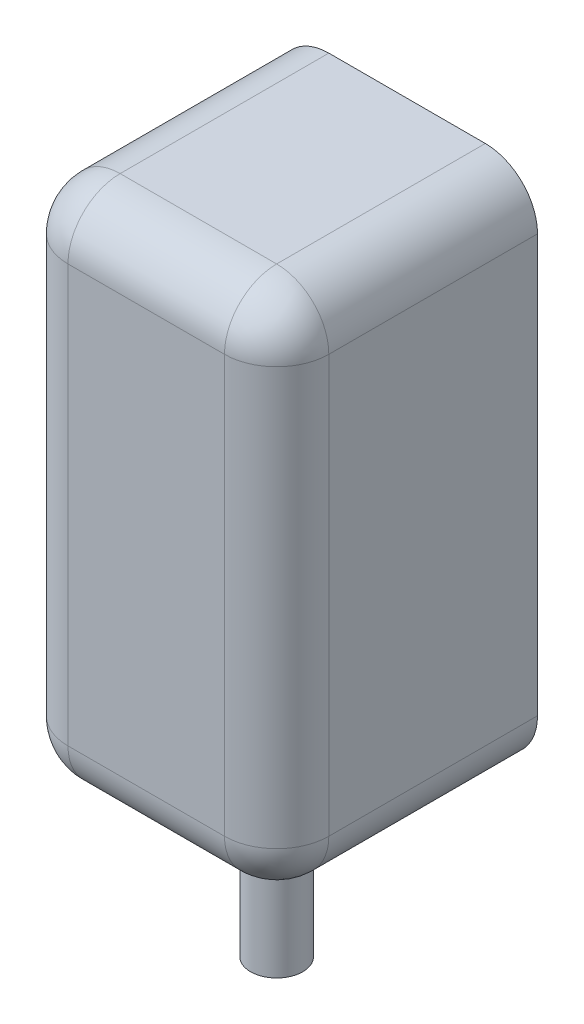
ISO-10303-21;
HEADER;
FILE_DESCRIPTION(('STEP AP214'),'2;1');
FILE_NAME('part.step','',(''),(''),'','','');
FILE_SCHEMA(('AUTOMOTIVE_DESIGN { 1 0 10303 214 1 1 1 1 }'));
ENDSEC;
DATA;
#1=APPLICATION_CONTEXT('core data for automotive mechanical design processes');
#2=APPLICATION_PROTOCOL_DEFINITION('international standard','automotive_design',2000,#1);
#3=PRODUCT_CONTEXT('',#1,'mechanical');
#4=PRODUCT('Part','Part','',(#3));
#5=PRODUCT_RELATED_PRODUCT_CATEGORY('part','',(#4));
#6=PRODUCT_DEFINITION_FORMATION('','',#4);
#7=PRODUCT_DEFINITION_CONTEXT('part definition',#1,'design');
#8=PRODUCT_DEFINITION('design','',#6,#7);
#9=PRODUCT_DEFINITION_SHAPE('','',#8);
#10=(LENGTH_UNIT() NAMED_UNIT(*) SI_UNIT(.MILLI.,.METRE.));
#11=(NAMED_UNIT(*) PLANE_ANGLE_UNIT() SI_UNIT($,.RADIAN.));
#12=(NAMED_UNIT(*) SI_UNIT($,.STERADIAN.) SOLID_ANGLE_UNIT());
#13=UNCERTAINTY_MEASURE_WITH_UNIT(LENGTH_MEASURE(1.E-05),#10,'distance_accuracy_value','');
#14=(GEOMETRIC_REPRESENTATION_CONTEXT(3) GLOBAL_UNCERTAINTY_ASSIGNED_CONTEXT((#13)) GLOBAL_UNIT_ASSIGNED_CONTEXT((#10,
#11,#12)) REPRESENTATION_CONTEXT('',''));
#15=CARTESIAN_POINT('',(0.,0.,0.));
#16=DIRECTION('',(0.,0.,1.));
#17=DIRECTION('',(1.,0.,0.));
#18=AXIS2_PLACEMENT_3D('',#15,#16,#17);
#19=CARTESIAN_POINT('',(0.,0.,0.));
#20=DIRECTION('',(0.,1.,0.));
#21=DIRECTION('',(0.,0.,1.));
#22=AXIS2_PLACEMENT_3D('',#19,#20,#21);
#23=PLANE('',#22);
#24=DIRECTION('',(1.,0.,0.));
#25=VECTOR('',#24,1.);
#26=CARTESIAN_POINT('',(0.,0.,15.));
#27=LINE('',#26,#25);
#28=CARTESIAN_POINT('',(15.,0.,15.));
#29=VERTEX_POINT('',#28);
#30=CARTESIAN_POINT('',(-15.,0.,15.));
#31=VERTEX_POINT('',#30);
#32=EDGE_CURVE('E233',#29,#31,#27,.F.);
#33=ORIENTED_EDGE('',*,*,#32,.T.);
#34=DIRECTION('',(0.,0.,1.));
#35=VECTOR('',#34,1.);
#36=CARTESIAN_POINT('',(-15.,0.,0.));
#37=LINE('',#36,#35);
#38=CARTESIAN_POINT('',(-15.,0.,-25.));
#39=VERTEX_POINT('',#38);
#40=EDGE_CURVE('E11',#31,#39,#37,.F.);
#41=ORIENTED_EDGE('',*,*,#40,.T.);
#42=DIRECTION('',(-1.,0.,0.));
#43=VECTOR('',#42,1.);
#44=CARTESIAN_POINT('',(-25.,0.,-25.));
#45=LINE('',#44,#43);
#46=CARTESIAN_POINT('',(15.,0.,-25.));
#47=VERTEX_POINT('',#46);
#48=EDGE_CURVE('E211',#47,#39,#45,.T.);
#49=ORIENTED_EDGE('',*,*,#48,.F.);
#50=DIRECTION('',(0.,0.,-1.));
#51=VECTOR('',#50,1.);
#52=CARTESIAN_POINT('',(15.,0.,0.));
#53=LINE('',#52,#51);
#54=EDGE_CURVE('E46',#47,#29,#53,.F.);
#55=ORIENTED_EDGE('',*,*,#54,.T.);
#56=EDGE_LOOP('',(#33,#41,#49,#55));
#57=FACE_BOUND('',#56,.T.);
#58=CARTESIAN_POINT('',(0.,0.,0.));
#59=DIRECTION('',(0.,1.,0.));
#60=DIRECTION('',(0.,0.,1.));
#61=AXIS2_PLACEMENT_3D('',#58,#59,#60);
#62=CIRCLE('',#61,5.);
#63=CARTESIAN_POINT('',(0.,0.,5.));
#64=VERTEX_POINT('',#63);
#65=EDGE_CURVE('E150',#64,#64,#62,.F.);
#66=ORIENTED_EDGE('',*,*,#65,.F.);
#67=EDGE_LOOP('',(#66));
#68=FACE_BOUND('',#67,.T.);
#69=ADVANCED_FACE('F37',(#57,#68),#23,.F.);
#70=CARTESIAN_POINT('',(25.,100.,-25.));
#71=DIRECTION('',(-1.,0.,0.));
#72=DIRECTION('',(0.,0.,1.));
#73=AXIS2_PLACEMENT_3D('',#70,#71,#72);
#74=PLANE('',#73);
#75=DIRECTION('',(0.,-1.,0.));
#76=VECTOR('',#75,1.);
#77=CARTESIAN_POINT('',(25.,100.,-25.));
#78=LINE('',#77,#76);
#79=CARTESIAN_POINT('',(25.,90.,-25.));
#80=VERTEX_POINT('',#79);
#81=CARTESIAN_POINT('',(25.,9.99999999999999,-25.));
#82=VERTEX_POINT('',#81);
#83=EDGE_CURVE('E213',#80,#82,#78,.T.);
#84=ORIENTED_EDGE('',*,*,#83,.F.);
#85=DIRECTION('',(0.,0.,-1.));
#86=VECTOR('',#85,1.);
#87=CARTESIAN_POINT('',(25.,90.,15.));
#88=LINE('',#87,#86);
#89=CARTESIAN_POINT('',(25.,90.,15.));
#90=VERTEX_POINT('',#89);
#91=EDGE_CURVE('E187',#80,#90,#88,.F.);
#92=ORIENTED_EDGE('',*,*,#91,.T.);
#93=DIRECTION('',(0.,-1.,0.));
#94=VECTOR('',#93,1.);
#95=CARTESIAN_POINT('',(25.,100.,15.));
#96=LINE('',#95,#94);
#97=CARTESIAN_POINT('',(25.,9.99999999999999,15.));
#98=VERTEX_POINT('',#97);
#99=EDGE_CURVE('E236',#90,#98,#96,.T.);
#100=ORIENTED_EDGE('',*,*,#99,.T.);
#101=DIRECTION('',(0.,0.,-1.));
#102=VECTOR('',#101,1.);
#103=CARTESIAN_POINT('',(25.,9.99999999999999,-25.));
#104=LINE('',#103,#102);
#105=EDGE_CURVE('E54',#98,#82,#104,.T.);
#106=ORIENTED_EDGE('',*,*,#105,.T.);
#107=EDGE_LOOP('',(#84,#92,#100,#106));
#108=FACE_BOUND('',#107,.T.);
#109=ADVANCED_FACE('F259',(#108),#74,.F.);
#110=CARTESIAN_POINT('',(-25.,100.,-25.));
#111=DIRECTION('',(0.,0.,1.));
#112=DIRECTION('',(1.,0.,0.));
#113=AXIS2_PLACEMENT_3D('',#110,#111,#112);
#114=PLANE('',#113);
#115=DIRECTION('',(0.,-1.,0.));
#116=VECTOR('',#115,1.);
#117=CARTESIAN_POINT('',(-25.,100.,-25.));
#118=LINE('',#117,#116);
#119=CARTESIAN_POINT('',(-25.,90.,-25.));
#120=VERTEX_POINT('',#119);
#121=CARTESIAN_POINT('',(-25.,9.99999999999999,-25.));
#122=VERTEX_POINT('',#121);
#123=EDGE_CURVE('E221',#120,#122,#118,.T.);
#124=ORIENTED_EDGE('',*,*,#123,.F.);
#125=CARTESIAN_POINT('',(-15.,90.,-25.));
#126=DIRECTION('',(0.,0.,1.));
#127=DIRECTION('',(1.,0.,0.));
#128=AXIS2_PLACEMENT_3D('',#125,#126,#127);
#129=CIRCLE('',#128,10.);
#130=CARTESIAN_POINT('',(-15.,100.,-25.));
#131=VERTEX_POINT('',#130);
#132=EDGE_CURVE('E184',#120,#131,#129,.F.);
#133=ORIENTED_EDGE('',*,*,#132,.T.);
#134=DIRECTION('',(-1.,0.,0.));
#135=VECTOR('',#134,1.);
#136=CARTESIAN_POINT('',(-25.,100.,-25.));
#137=LINE('',#136,#135);
#138=CARTESIAN_POINT('',(15.,100.,-25.));
#139=VERTEX_POINT('',#138);
#140=EDGE_CURVE('E218',#139,#131,#137,.T.);
#141=ORIENTED_EDGE('',*,*,#140,.F.);
#142=CARTESIAN_POINT('',(15.,90.,-25.));
#143=DIRECTION('',(0.,0.,1.));
#144=DIRECTION('',(1.,0.,0.));
#145=AXIS2_PLACEMENT_3D('',#142,#143,#144);
#146=CIRCLE('',#145,10.);
#147=EDGE_CURVE('E61',#139,#80,#146,.F.);
#148=ORIENTED_EDGE('',*,*,#147,.T.);
#149=ORIENTED_EDGE('',*,*,#83,.T.);
#150=CARTESIAN_POINT('',(15.,9.99999999999999,-25.));
#151=DIRECTION('',(0.,0.,1.));
#152=DIRECTION('',(1.,0.,0.));
#153=AXIS2_PLACEMENT_3D('',#150,#151,#152);
#154=CIRCLE('',#153,10.);
#155=EDGE_CURVE('E179',#82,#47,#154,.F.);
#156=ORIENTED_EDGE('',*,*,#155,.T.);
#157=ORIENTED_EDGE('',*,*,#48,.T.);
#158=CARTESIAN_POINT('',(-15.,9.99999999999999,-25.));
#159=DIRECTION('',(0.,0.,1.));
#160=DIRECTION('',(1.,0.,0.));
#161=AXIS2_PLACEMENT_3D('',#158,#159,#160);
#162=CIRCLE('',#161,10.);
#163=EDGE_CURVE('E181',#39,#122,#162,.F.);
#164=ORIENTED_EDGE('',*,*,#163,.T.);
#165=EDGE_LOOP('',(#124,#133,#141,#148,#149,#156,#157,#164));
#166=FACE_BOUND('',#165,.T.);
#167=ADVANCED_FACE('F210',(#166),#114,.F.);
#168=CARTESIAN_POINT('',(-25.,100.,-25.));
#169=DIRECTION('',(1.,0.,0.));
#170=DIRECTION('',(0.,0.,-1.));
#171=AXIS2_PLACEMENT_3D('',#168,#169,#170);
#172=PLANE('',#171);
#173=DIRECTION('',(0.,-1.,0.));
#174=VECTOR('',#173,1.);
#175=CARTESIAN_POINT('',(-25.,100.,15.));
#176=LINE('',#175,#174);
#177=CARTESIAN_POINT('',(-25.,9.99999999999999,15.));
#178=VERTEX_POINT('',#177);
#179=CARTESIAN_POINT('',(-25.,90.,15.));
#180=VERTEX_POINT('',#179);
#181=EDGE_CURVE('E157',#178,#180,#176,.F.);
#182=ORIENTED_EDGE('',*,*,#181,.T.);
#183=DIRECTION('',(0.,0.,1.));
#184=VECTOR('',#183,1.);
#185=CARTESIAN_POINT('',(-25.,90.,-25.));
#186=LINE('',#185,#184);
#187=EDGE_CURVE('E177',#180,#120,#186,.F.);
#188=ORIENTED_EDGE('',*,*,#187,.T.);
#189=ORIENTED_EDGE('',*,*,#123,.T.);
#190=DIRECTION('',(0.,0.,1.));
#191=VECTOR('',#190,1.);
#192=CARTESIAN_POINT('',(-25.,9.99999999999999,-25.));
#193=LINE('',#192,#191);
#194=EDGE_CURVE('E175',#122,#178,#193,.T.);
#195=ORIENTED_EDGE('',*,*,#194,.T.);
#196=EDGE_LOOP('',(#182,#188,#189,#195));
#197=FACE_BOUND('',#196,.T.);
#198=ADVANCED_FACE('F238',(#197),#172,.F.);
#199=CARTESIAN_POINT('',(-25.,100.,25.));
#200=DIRECTION('',(0.,0.,-1.));
#201=DIRECTION('',(-1.,0.,0.));
#202=AXIS2_PLACEMENT_3D('',#199,#200,#201);
#203=PLANE('',#202);
#204=DIRECTION('',(1.,0.,0.));
#205=VECTOR('',#204,1.);
#206=CARTESIAN_POINT('',(-25.,9.99999999999999,25.));
#207=LINE('',#206,#205);
#208=CARTESIAN_POINT('',(-15.,9.99999999999999,25.));
#209=VERTEX_POINT('',#208);
#210=CARTESIAN_POINT('',(15.,9.99999999999999,25.));
#211=VERTEX_POINT('',#210);
#212=EDGE_CURVE('E140',#209,#211,#207,.T.);
#213=ORIENTED_EDGE('',*,*,#212,.T.);
#214=DIRECTION('',(0.,-1.,0.));
#215=VECTOR('',#214,1.);
#216=CARTESIAN_POINT('',(15.,100.,25.));
#217=LINE('',#216,#215);
#218=CARTESIAN_POINT('',(15.,90.,25.));
#219=VERTEX_POINT('',#218);
#220=EDGE_CURVE('E139',#211,#219,#217,.F.);
#221=ORIENTED_EDGE('',*,*,#220,.T.);
#222=DIRECTION('',(1.,0.,0.));
#223=VECTOR('',#222,1.);
#224=CARTESIAN_POINT('',(-25.,90.,25.));
#225=LINE('',#224,#223);
#226=CARTESIAN_POINT('',(-15.,90.,25.));
#227=VERTEX_POINT('',#226);
#228=EDGE_CURVE('E121',#219,#227,#225,.F.);
#229=ORIENTED_EDGE('',*,*,#228,.T.);
#230=DIRECTION('',(0.,-1.,0.));
#231=VECTOR('',#230,1.);
#232=CARTESIAN_POINT('',(-15.,100.,25.));
#233=LINE('',#232,#231);
#234=EDGE_CURVE('E136',#227,#209,#233,.T.);
#235=ORIENTED_EDGE('',*,*,#234,.T.);
#236=EDGE_LOOP('',(#213,#221,#229,#235));
#237=FACE_BOUND('',#236,.T.);
#238=ADVANCED_FACE('F135',(#237),#203,.F.);
#239=CARTESIAN_POINT('',(0.,100.,0.));
#240=DIRECTION('',(0.,1.,0.));
#241=DIRECTION('',(0.,0.,1.));
#242=AXIS2_PLACEMENT_3D('',#239,#240,#241);
#243=PLANE('',#242);
#244=ORIENTED_EDGE('',*,*,#140,.T.);
#245=DIRECTION('',(0.,0.,1.));
#246=VECTOR('',#245,1.);
#247=CARTESIAN_POINT('',(-15.,100.,15.));
#248=LINE('',#247,#246);
#249=CARTESIAN_POINT('',(-15.,100.,15.));
#250=VERTEX_POINT('',#249);
#251=EDGE_CURVE('E173',#131,#250,#248,.T.);
#252=ORIENTED_EDGE('',*,*,#251,.T.);
#253=DIRECTION('',(1.,0.,0.));
#254=VECTOR('',#253,1.);
#255=CARTESIAN_POINT('',(25.,100.,15.));
#256=LINE('',#255,#254);
#257=CARTESIAN_POINT('',(15.,100.,15.));
#258=VERTEX_POINT('',#257);
#259=EDGE_CURVE('E123',#250,#258,#256,.T.);
#260=ORIENTED_EDGE('',*,*,#259,.T.);
#261=DIRECTION('',(0.,0.,-1.));
#262=VECTOR('',#261,1.);
#263=CARTESIAN_POINT('',(15.,100.,-25.));
#264=LINE('',#263,#262);
#265=EDGE_CURVE('E171',#258,#139,#264,.T.);
#266=ORIENTED_EDGE('',*,*,#265,.T.);
#267=EDGE_LOOP('',(#244,#252,#260,#266));
#268=FACE_BOUND('',#267,.T.);
#269=ADVANCED_FACE('F254',(#268),#243,.T.);
#270=CARTESIAN_POINT('',(0.,-30.,0.));
#271=DIRECTION('',(0.,1.,0.));
#272=DIRECTION('',(0.,0.,1.));
#273=AXIS2_PLACEMENT_3D('',#270,#271,#272);
#274=CYLINDRICAL_SURFACE('',#273,5.);
#275=CARTESIAN_POINT('',(0.,-30.,0.));
#276=DIRECTION('',(0.,-1.,0.));
#277=DIRECTION('',(0.,0.,-1.));
#278=AXIS2_PLACEMENT_3D('',#275,#276,#277);
#279=CIRCLE('',#278,5.);
#280=CARTESIAN_POINT('',(0.,-30.,-5.));
#281=VERTEX_POINT('',#280);
#282=EDGE_CURVE('E191',#281,#281,#279,.T.);
#283=ORIENTED_EDGE('',*,*,#282,.F.);
#284=EDGE_LOOP('',(#283));
#285=FACE_BOUND('',#284,.T.);
#286=ORIENTED_EDGE('',*,*,#65,.T.);
#287=EDGE_LOOP('',(#286));
#288=FACE_BOUND('',#287,.T.);
#289=ADVANCED_FACE('F345',(#285,#288),#274,.T.);
#290=CARTESIAN_POINT('',(0.,-30.,0.));
#291=DIRECTION('',(0.,-1.,0.));
#292=DIRECTION('',(0.,0.,-1.));
#293=AXIS2_PLACEMENT_3D('',#290,#291,#292);
#294=PLANE('',#293);
#295=ORIENTED_EDGE('',*,*,#282,.T.);
#296=EDGE_LOOP('',(#295));
#297=FACE_BOUND('',#296,.T.);
#298=ADVANCED_FACE('F279',(#297),#294,.T.);
#299=CARTESIAN_POINT('',(0.,90.,15.));
#300=DIRECTION('',(-1.,0.,0.));
#301=DIRECTION('',(0.,0.,1.));
#302=AXIS2_PLACEMENT_3D('',#299,#300,#301);
#303=CYLINDRICAL_SURFACE('',#302,10.);
#304=ORIENTED_EDGE('',*,*,#259,.F.);
#305=CARTESIAN_POINT('',(-15.,90.,15.));
#306=DIRECTION('',(-1.,0.,0.));
#307=DIRECTION('',(0.,0.,1.));
#308=AXIS2_PLACEMENT_3D('',#305,#306,#307);
#309=CIRCLE('',#308,10.);
#310=EDGE_CURVE('E118',#250,#227,#309,.F.);
#311=ORIENTED_EDGE('',*,*,#310,.T.);
#312=ORIENTED_EDGE('',*,*,#228,.F.);
#313=CARTESIAN_POINT('',(15.,90.,15.));
#314=DIRECTION('',(-1.,0.,0.));
#315=DIRECTION('',(0.,0.,1.));
#316=AXIS2_PLACEMENT_3D('',#313,#314,#315);
#317=CIRCLE('',#316,10.);
#318=EDGE_CURVE('E128',#219,#258,#317,.T.);
#319=ORIENTED_EDGE('',*,*,#318,.T.);
#320=EDGE_LOOP('',(#304,#311,#312,#319));
#321=FACE_BOUND('',#320,.T.);
#322=ADVANCED_FACE('F120',(#321),#303,.T.);
#323=CARTESIAN_POINT('',(-15.,100.,15.));
#324=DIRECTION('',(0.,-1.,0.));
#325=DIRECTION('',(0.,0.,-1.));
#326=AXIS2_PLACEMENT_3D('',#323,#324,#325);
#327=CYLINDRICAL_SURFACE('',#326,10.);
#328=ORIENTED_EDGE('',*,*,#234,.F.);
#329=CARTESIAN_POINT('',(-15.,90.,15.));
#330=DIRECTION('',(0.,-1.,0.));
#331=DIRECTION('',(0.,0.,-1.));
#332=AXIS2_PLACEMENT_3D('',#329,#330,#331);
#333=CIRCLE('',#332,10.);
#334=EDGE_CURVE('E146',#227,#180,#333,.T.);
#335=ORIENTED_EDGE('',*,*,#334,.T.);
#336=ORIENTED_EDGE('',*,*,#181,.F.);
#337=CARTESIAN_POINT('',(-15.,9.99999999999999,15.));
#338=DIRECTION('',(0.,-1.,0.));
#339=DIRECTION('',(0.,0.,-1.));
#340=AXIS2_PLACEMENT_3D('',#337,#338,#339);
#341=CIRCLE('',#340,10.);
#342=EDGE_CURVE('E149',#178,#209,#341,.F.);
#343=ORIENTED_EDGE('',*,*,#342,.T.);
#344=EDGE_LOOP('',(#328,#335,#336,#343));
#345=FACE_BOUND('',#344,.T.);
#346=ADVANCED_FACE('F144',(#345),#327,.T.);
#347=CARTESIAN_POINT('',(15.,100.,15.));
#348=DIRECTION('',(0.,-1.,0.));
#349=DIRECTION('',(0.,0.,-1.));
#350=AXIS2_PLACEMENT_3D('',#347,#348,#349);
#351=CYLINDRICAL_SURFACE('',#350,10.);
#352=ORIENTED_EDGE('',*,*,#99,.F.);
#353=CARTESIAN_POINT('',(15.,90.,15.));
#354=DIRECTION('',(0.,-1.,0.));
#355=DIRECTION('',(0.,0.,-1.));
#356=AXIS2_PLACEMENT_3D('',#353,#354,#355);
#357=CIRCLE('',#356,10.);
#358=EDGE_CURVE('E162',#90,#219,#357,.T.);
#359=ORIENTED_EDGE('',*,*,#358,.T.);
#360=ORIENTED_EDGE('',*,*,#220,.F.);
#361=CARTESIAN_POINT('',(15.,9.99999999999999,15.));
#362=DIRECTION('',(0.,-1.,0.));
#363=DIRECTION('',(0.,0.,-1.));
#364=AXIS2_PLACEMENT_3D('',#361,#362,#363);
#365=CIRCLE('',#364,10.);
#366=EDGE_CURVE('E127',#211,#98,#365,.F.);
#367=ORIENTED_EDGE('',*,*,#366,.T.);
#368=EDGE_LOOP('',(#352,#359,#360,#367));
#369=FACE_BOUND('',#368,.T.);
#370=ADVANCED_FACE('F247',(#369),#351,.T.);
#371=CARTESIAN_POINT('',(-25.,9.99999999999999,15.));
#372=DIRECTION('',(1.,0.,0.));
#373=DIRECTION('',(0.,0.,-1.));
#374=AXIS2_PLACEMENT_3D('',#371,#372,#373);
#375=CYLINDRICAL_SURFACE('',#374,10.);
#376=ORIENTED_EDGE('',*,*,#212,.F.);
#377=CARTESIAN_POINT('',(-15.,9.99999999999999,15.));
#378=DIRECTION('',(1.,0.,0.));
#379=DIRECTION('',(0.,0.,-1.));
#380=AXIS2_PLACEMENT_3D('',#377,#378,#379);
#381=CIRCLE('',#380,10.);
#382=EDGE_CURVE('E168',#209,#31,#381,.T.);
#383=ORIENTED_EDGE('',*,*,#382,.T.);
#384=ORIENTED_EDGE('',*,*,#32,.F.);
#385=CARTESIAN_POINT('',(15.,9.99999999999999,15.));
#386=DIRECTION('',(1.,0.,0.));
#387=DIRECTION('',(0.,0.,-1.));
#388=AXIS2_PLACEMENT_3D('',#385,#386,#387);
#389=CIRCLE('',#388,10.);
#390=EDGE_CURVE('E165',#29,#211,#389,.F.);
#391=ORIENTED_EDGE('',*,*,#390,.T.);
#392=EDGE_LOOP('',(#376,#383,#384,#391));
#393=FACE_BOUND('',#392,.T.);
#394=ADVANCED_FACE('F244',(#393),#375,.T.);
#395=CARTESIAN_POINT('',(-15.,90.,0.));
#396=DIRECTION('',(0.,0.,-1.));
#397=DIRECTION('',(-1.,0.,0.));
#398=AXIS2_PLACEMENT_3D('',#395,#396,#397);
#399=CYLINDRICAL_SURFACE('',#398,10.);
#400=ORIENTED_EDGE('',*,*,#132,.F.);
#401=ORIENTED_EDGE('',*,*,#187,.F.);
#402=CARTESIAN_POINT('',(-15.,90.,15.));
#403=DIRECTION('',(0.,0.,1.));
#404=DIRECTION('',(1.,0.,0.));
#405=AXIS2_PLACEMENT_3D('',#402,#403,#404);
#406=CIRCLE('',#405,10.);
#407=EDGE_CURVE('E153',#250,#180,#406,.T.);
#408=ORIENTED_EDGE('',*,*,#407,.F.);
#409=ORIENTED_EDGE('',*,*,#251,.F.);
#410=EDGE_LOOP('',(#400,#401,#408,#409));
#411=FACE_BOUND('',#410,.T.);
#412=ADVANCED_FACE('F272',(#411),#399,.T.);
#413=CARTESIAN_POINT('',(-15.,90.,15.));
#414=DIRECTION('',(0.,0.,1.));
#415=DIRECTION('',(1.,0.,0.));
#416=AXIS2_PLACEMENT_3D('',#413,#414,#415);
#417=SPHERICAL_SURFACE('',#416,10.);
#418=ORIENTED_EDGE('',*,*,#334,.F.);
#419=ORIENTED_EDGE('',*,*,#310,.F.);
#420=ORIENTED_EDGE('',*,*,#407,.T.);
#421=EDGE_LOOP('',(#418,#419,#420));
#422=FACE_BOUND('',#421,.T.);
#423=ADVANCED_FACE('F152',(#422),#417,.T.);
#424=CARTESIAN_POINT('',(15.,90.,0.));
#425=DIRECTION('',(0.,0.,1.));
#426=DIRECTION('',(1.,0.,0.));
#427=AXIS2_PLACEMENT_3D('',#424,#425,#426);
#428=CYLINDRICAL_SURFACE('',#427,10.);
#429=ORIENTED_EDGE('',*,*,#147,.F.);
#430=ORIENTED_EDGE('',*,*,#265,.F.);
#431=CARTESIAN_POINT('',(15.,90.,15.));
#432=DIRECTION('',(0.,0.,1.));
#433=DIRECTION('',(0.,-1.,0.));
#434=AXIS2_PLACEMENT_3D('',#431,#432,#433);
#435=CIRCLE('',#434,10.);
#436=EDGE_CURVE('E192',#90,#258,#435,.T.);
#437=ORIENTED_EDGE('',*,*,#436,.F.);
#438=ORIENTED_EDGE('',*,*,#91,.F.);
#439=EDGE_LOOP('',(#429,#430,#437,#438));
#440=FACE_BOUND('',#439,.T.);
#441=ADVANCED_FACE('F257',(#440),#428,.T.);
#442=CARTESIAN_POINT('',(15.,90.,15.));
#443=DIRECTION('',(0.,0.,1.));
#444=DIRECTION('',(1.,0.,0.));
#445=AXIS2_PLACEMENT_3D('',#442,#443,#444);
#446=SPHERICAL_SURFACE('',#445,10.);
#447=ORIENTED_EDGE('',*,*,#436,.T.);
#448=ORIENTED_EDGE('',*,*,#318,.F.);
#449=ORIENTED_EDGE('',*,*,#358,.F.);
#450=EDGE_LOOP('',(#447,#448,#449));
#451=FACE_BOUND('',#450,.T.);
#452=ADVANCED_FACE('F251',(#451),#446,.T.);
#453=CARTESIAN_POINT('',(-15.,9.99999999999999,-25.));
#454=DIRECTION('',(0.,0.,1.));
#455=DIRECTION('',(1.,0.,0.));
#456=AXIS2_PLACEMENT_3D('',#453,#454,#455);
#457=CYLINDRICAL_SURFACE('',#456,10.);
#458=ORIENTED_EDGE('',*,*,#163,.F.);
#459=ORIENTED_EDGE('',*,*,#40,.F.);
#460=CARTESIAN_POINT('',(-15.,9.99999999999999,15.));
#461=DIRECTION('',(0.,0.,1.));
#462=DIRECTION('',(1.,0.,0.));
#463=AXIS2_PLACEMENT_3D('',#460,#461,#462);
#464=CIRCLE('',#463,10.);
#465=EDGE_CURVE('E194',#178,#31,#464,.T.);
#466=ORIENTED_EDGE('',*,*,#465,.F.);
#467=ORIENTED_EDGE('',*,*,#194,.F.);
#468=EDGE_LOOP('',(#458,#459,#466,#467));
#469=FACE_BOUND('',#468,.T.);
#470=ADVANCED_FACE('F242',(#469),#457,.T.);
#471=CARTESIAN_POINT('',(-15.,9.99999999999999,15.));
#472=DIRECTION('',(0.,0.,1.));
#473=DIRECTION('',(1.,0.,0.));
#474=AXIS2_PLACEMENT_3D('',#471,#472,#473);
#475=SPHERICAL_SURFACE('',#474,10.);
#476=ORIENTED_EDGE('',*,*,#382,.F.);
#477=ORIENTED_EDGE('',*,*,#342,.F.);
#478=ORIENTED_EDGE('',*,*,#465,.T.);
#479=EDGE_LOOP('',(#476,#477,#478));
#480=FACE_BOUND('',#479,.T.);
#481=ADVANCED_FACE('F240',(#480),#475,.T.);
#482=CARTESIAN_POINT('',(15.,9.99999999999999,-25.));
#483=DIRECTION('',(0.,0.,-1.));
#484=DIRECTION('',(-1.,0.,0.));
#485=AXIS2_PLACEMENT_3D('',#482,#483,#484);
#486=CYLINDRICAL_SURFACE('',#485,10.);
#487=ORIENTED_EDGE('',*,*,#155,.F.);
#488=ORIENTED_EDGE('',*,*,#105,.F.);
#489=CARTESIAN_POINT('',(15.,10.,15.));
#490=DIRECTION('',(0.,0.,1.));
#491=DIRECTION('',(1.,0.,0.));
#492=AXIS2_PLACEMENT_3D('',#489,#490,#491);
#493=CIRCLE('',#492,10.);
#494=EDGE_CURVE('E41',#29,#98,#493,.T.);
#495=ORIENTED_EDGE('',*,*,#494,.F.);
#496=ORIENTED_EDGE('',*,*,#54,.F.);
#497=EDGE_LOOP('',(#487,#488,#495,#496));
#498=FACE_BOUND('',#497,.T.);
#499=ADVANCED_FACE('F39',(#498),#486,.T.);
#500=CARTESIAN_POINT('',(15.,9.99999999999999,15.));
#501=DIRECTION('',(0.,0.,1.));
#502=DIRECTION('',(1.,0.,0.));
#503=AXIS2_PLACEMENT_3D('',#500,#501,#502);
#504=SPHERICAL_SURFACE('',#503,10.);
#505=ORIENTED_EDGE('',*,*,#494,.T.);
#506=ORIENTED_EDGE('',*,*,#366,.F.);
#507=ORIENTED_EDGE('',*,*,#390,.F.);
#508=EDGE_LOOP('',(#505,#506,#507));
#509=FACE_BOUND('',#508,.T.);
#510=ADVANCED_FACE('F203',(#509),#504,.T.);
#511=CLOSED_SHELL('',(#69,#109,#167,#198,#238,#269,#289,#298,#322,#346,#370,#394,#412,#423,#441,
#452,#470,#481,#499,#510));
#512=MANIFOLD_SOLID_BREP('B2',#511);
#513=ADVANCED_BREP_SHAPE_REPRESENTATION('',(#18,#512),#14);
#514=SHAPE_DEFINITION_REPRESENTATION(#9,#513);
ENDSEC;
END-ISO-10303-21;
